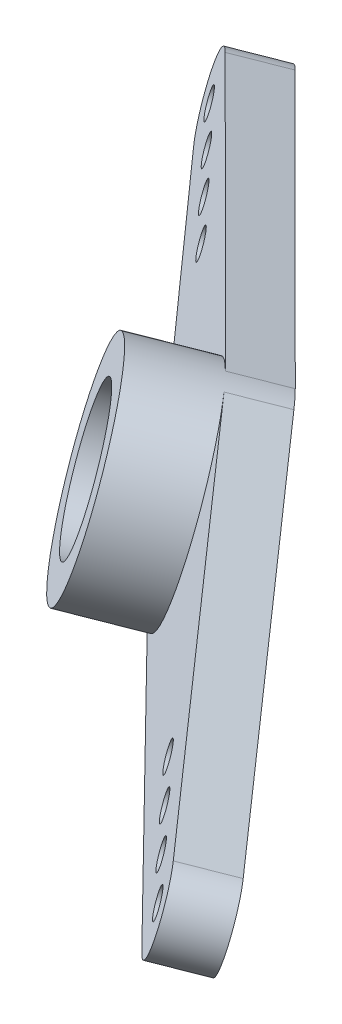
ISO-10303-21;
HEADER;
FILE_DESCRIPTION(('STEP AP214'),'2;1');
FILE_NAME('part.step','',(''),(''),'','','');
FILE_SCHEMA(('AUTOMOTIVE_DESIGN { 1 0 10303 214 1 1 1 1 }'));
ENDSEC;
DATA;
#1=APPLICATION_CONTEXT('core data for automotive mechanical design processes');
#2=APPLICATION_PROTOCOL_DEFINITION('international standard','automotive_design',2000,#1);
#3=PRODUCT_CONTEXT('',#1,'mechanical');
#4=PRODUCT('Part','Part','',(#3));
#5=PRODUCT_RELATED_PRODUCT_CATEGORY('part','',(#4));
#6=PRODUCT_DEFINITION_FORMATION('','',#4);
#7=PRODUCT_DEFINITION_CONTEXT('part definition',#1,'design');
#8=PRODUCT_DEFINITION('design','',#6,#7);
#9=PRODUCT_DEFINITION_SHAPE('','',#8);
#10=(LENGTH_UNIT() NAMED_UNIT(*) SI_UNIT(.MILLI.,.METRE.));
#11=(NAMED_UNIT(*) PLANE_ANGLE_UNIT() SI_UNIT($,.RADIAN.));
#12=(NAMED_UNIT(*) SI_UNIT($,.STERADIAN.) SOLID_ANGLE_UNIT());
#13=UNCERTAINTY_MEASURE_WITH_UNIT(LENGTH_MEASURE(1.E-05),#10,'distance_accuracy_value','');
#14=(GEOMETRIC_REPRESENTATION_CONTEXT(3) GLOBAL_UNCERTAINTY_ASSIGNED_CONTEXT((#13)) GLOBAL_UNIT_ASSIGNED_CONTEXT((#10,
#11,#12)) REPRESENTATION_CONTEXT('',''));
#15=CARTESIAN_POINT('',(0.,0.,0.));
#16=DIRECTION('',(0.,0.,1.));
#17=DIRECTION('',(1.,0.,0.));
#18=AXIS2_PLACEMENT_3D('',#15,#16,#17);
#19=CARTESIAN_POINT('',(-53.5665780673376,-93.2878245452242,38.8750016026437));
#20=DIRECTION('',(0.709922761595776,-0.268514569517587,-0.651083403662704));
#21=DIRECTION('',(-0.675905616300296,0.,-0.736988193836045));
#22=AXIS2_PLACEMENT_3D('',#19,#20,#21);
#23=CYLINDRICAL_SURFACE('',#22,1.13402350588104);
#24=CARTESIAN_POINT('',(-52.5026878168102,-93.6902204791033,37.8992880139147));
#25=DIRECTION('',(-0.709922761595776,0.268514569517587,0.651083403662704));
#26=DIRECTION('',(0.675905616300296,0.,0.736988193836045));
#27=AXIS2_PLACEMENT_3D('',#24,#25,#26);
#28=CIRCLE('',#27,1.13402350588104);
#29=CARTESIAN_POINT('',(-51.7361949601686,-93.6902204791033,38.7350499492816));
#30=VERTEX_POINT('',#29);
#31=EDGE_CURVE('E140',#30,#30,#28,.T.);
#32=ORIENTED_EDGE('',*,*,#31,.F.);
#33=EDGE_LOOP('',(#32));
#34=FACE_BOUND('',#33,.T.);
#35=CARTESIAN_POINT('',(-53.2960974951696,-93.3901285962104,38.6269388258482));
#36=DIRECTION('',(-0.709922761595776,0.268514569517587,0.651083403662705));
#37=DIRECTION('',(0.675905616300297,0.,0.736988193836045));
#38=AXIS2_PLACEMENT_3D('',#35,#36,#37);
#39=CIRCLE('',#38,1.13402350588104);
#40=CARTESIAN_POINT('',(-52.5296046385281,-93.3901285962104,39.4627007612151));
#41=VERTEX_POINT('',#40);
#42=EDGE_CURVE('E41',#41,#41,#39,.T.);
#43=ORIENTED_EDGE('',*,*,#42,.T.);
#44=EDGE_LOOP('',(#43));
#45=FACE_BOUND('',#44,.T.);
#46=ADVANCED_FACE('F37',(#34,#45),#23,.F.);
#47=CARTESIAN_POINT('',(-53.5665780673376,-93.2878245452242,38.8750016026437));
#48=DIRECTION('',(-0.709922761595776,0.268514569517587,0.651083403662704));
#49=DIRECTION('',(0.675905616300296,0.,0.736988193836045));
#50=AXIS2_PLACEMENT_3D('',#47,#48,#49);
#51=PLANE('',#50);
#52=CARTESIAN_POINT('',(-63.7380817432414,-93.9023006433935,28.0377015662634));
#53=DIRECTION('',(-0.709922761595776,0.268514569517587,0.651083403662704));
#54=DIRECTION('',(-0.675905616300296,0.,-0.736988193836045));
#55=AXIS2_PLACEMENT_3D('',#52,#53,#54);
#56=CIRCLE('',#55,0.399750462625913);
#57=CARTESIAN_POINT('',(-64.0082753260489,-93.9023006433935,27.7430901948276));
#58=VERTEX_POINT('',#57);
#59=EDGE_CURVE('E191',#58,#58,#56,.T.);
#60=ORIENTED_EDGE('',*,*,#59,.F.);
#61=EDGE_LOOP('',(#60));
#62=FACE_BOUND('',#61,.T.);
#63=CARTESIAN_POINT('',(-61.3063283656559,-93.7553947015799,30.6286302831066));
#64=DIRECTION('',(-0.709922761595776,0.268514569517587,0.651083403662704));
#65=DIRECTION('',(-0.675905616300296,0.,-0.736988193836045));
#66=AXIS2_PLACEMENT_3D('',#63,#64,#65);
#67=CIRCLE('',#66,0.399750462625915);
#68=CARTESIAN_POINT('',(-61.5765219484634,-93.7553947015799,30.3340189116708));
#69=VERTEX_POINT('',#68);
#70=EDGE_CURVE('E203',#69,#69,#67,.T.);
#71=ORIENTED_EDGE('',*,*,#70,.F.);
#72=EDGE_LOOP('',(#71));
#73=FACE_BOUND('',#72,.T.);
#74=CARTESIAN_POINT('',(-60.0904516768631,-93.6819417306731,31.9240946415282));
#75=DIRECTION('',(-0.709922761595776,0.268514569517587,0.651083403662704));
#76=DIRECTION('',(-0.675905616300296,0.,-0.736988193836045));
#77=AXIS2_PLACEMENT_3D('',#74,#75,#76);
#78=CIRCLE('',#77,0.39975046262591);
#79=CARTESIAN_POINT('',(-60.3606452596706,-93.6819417306731,31.6294832700924));
#80=VERTEX_POINT('',#79);
#81=EDGE_CURVE('E209',#80,#80,#78,.T.);
#82=ORIENTED_EDGE('',*,*,#81,.F.);
#83=EDGE_LOOP('',(#82));
#84=FACE_BOUND('',#83,.T.);
#85=CARTESIAN_POINT('',(-62.5222050544486,-93.8288476724867,29.333165924685));
#86=DIRECTION('',(-0.709922761595776,0.268514569517587,0.651083403662704));
#87=DIRECTION('',(-0.675905616300296,0.,-0.736988193836045));
#88=AXIS2_PLACEMENT_3D('',#85,#86,#87);
#89=CIRCLE('',#88,0.399750462625906);
#90=CARTESIAN_POINT('',(-62.7923986372561,-93.8288476724867,29.0385545532492));
#91=VERTEX_POINT('',#90);
#92=EDGE_CURVE('E197',#91,#91,#89,.T.);
#93=ORIENTED_EDGE('',*,*,#92,.F.);
#94=EDGE_LOOP('',(#93));
#95=FACE_BOUND('',#94,.T.);
#96=DIRECTION('',(0.659303735452533,-0.0716887488780678,0.748451272764389));
#97=VECTOR('',#96,1.);
#98=CARTESIAN_POINT('',(-64.0394447887795,-95.0712729380114,28.1912020339051));
#99=LINE('',#98,#97);
#100=CARTESIAN_POINT('',(-64.0394447887795,-95.0712729380114,28.1912020339051));
#101=VERTEX_POINT('',#100);
#102=CARTESIAN_POINT('',(-54.2993856472221,-96.130348772577,39.2482600623954));
#103=VERTEX_POINT('',#102);
#104=EDGE_CURVE('E121',#101,#103,#99,.T.);
#105=ORIENTED_EDGE('',*,*,#104,.T.);
#106=CARTESIAN_POINT('',(-53.5665780673376,-93.2878245452242,38.8750016026437));
#107=DIRECTION('',(-0.709922761595776,0.268514569517587,0.651083403662705));
#108=DIRECTION('',(0.675905616300297,0.,0.736988193836045));
#109=AXIS2_PLACEMENT_3D('',#106,#107,#108);
#110=CIRCLE('',#109,2.9591);
#111=CARTESIAN_POINT('',(-53.3077059111959,-90.4739314818807,37.9967853167313));
#112=VERTEX_POINT('',#111);
#113=EDGE_CURVE('E100',#112,#103,#110,.T.);
#114=ORIENTED_EDGE('',*,*,#113,.F.);
#115=DIRECTION('',(-0.698824960690639,-0.153735381176378,-0.698576486070266));
#116=VECTOR('',#115,1.);
#117=CARTESIAN_POINT('',(-53.3077059111959,-90.4739314818807,37.9967853167313));
#118=LINE('',#117,#116);
#119=CARTESIAN_POINT('',(-63.6316220073961,-92.7451027558915,27.6765399983038));
#120=VERTEX_POINT('',#119);
#121=EDGE_CURVE('E151',#112,#120,#118,.T.);
#122=ORIENTED_EDGE('',*,*,#121,.T.);
#123=CARTESIAN_POINT('',(-63.7380817432414,-93.9023006433935,28.0377015662634));
#124=DIRECTION('',(-0.709922761595776,0.268514569517587,0.651083403662704));
#125=DIRECTION('',(0.675905616300296,0.,0.736988193836045));
#126=AXIS2_PLACEMENT_3D('',#123,#124,#125);
#127=CIRCLE('',#126,1.21691343339055);
#128=EDGE_CURVE('E168',#120,#101,#127,.T.);
#129=ORIENTED_EDGE('',*,*,#128,.T.);
#130=EDGE_LOOP('',(#105,#114,#122,#129));
#131=FACE_BOUND('',#130,.T.);
#132=ADVANCED_FACE('F241',(#62,#73,#84,#95,#131),#51,.T.);
#133=CARTESIAN_POINT('',(-47.0933141988821,-93.166185704805,45.8830984693304));
#134=DIRECTION('',(-0.709922761595776,0.268514569517587,0.651083403662704));
#135=DIRECTION('',(0.675905616300296,0.,0.736988193836045));
#136=AXIS2_PLACEMENT_3D('',#133,#134,#135);
#137=CIRCLE('',#136,0.399750462625914);
#138=CARTESIAN_POINT('',(-46.8231206160746,-93.166185704805,46.1777098407662));
#139=VERTEX_POINT('',#138);
#140=EDGE_CURVE('E215',#139,#139,#137,.T.);
#141=ORIENTED_EDGE('',*,*,#140,.F.);
#142=EDGE_LOOP('',(#141));
#143=FACE_BOUND('',#142,.T.);
#144=CARTESIAN_POINT('',(-44.6804254431688,-93.1208452094583,48.4953445436762));
#145=DIRECTION('',(-0.709922761595776,0.268514569517587,0.651083403662704));
#146=DIRECTION('',(0.675905616300296,0.,0.736988193836045));
#147=AXIS2_PLACEMENT_3D('',#144,#145,#146);
#148=CIRCLE('',#147,0.3997504626259);
#149=CARTESIAN_POINT('',(-44.4102318603613,-93.1208452094583,48.789955915112));
#150=VERTEX_POINT('',#149);
#151=EDGE_CURVE('E227',#150,#150,#148,.T.);
#152=ORIENTED_EDGE('',*,*,#151,.F.);
#153=EDGE_LOOP('',(#152));
#154=FACE_BOUND('',#153,.T.);
#155=CARTESIAN_POINT('',(-43.4739810653122,-93.098174961785,49.8014675808492));
#156=DIRECTION('',(-0.709922761595776,0.268514569517587,0.651083403662704));
#157=DIRECTION('',(0.675905616300296,0.,0.736988193836045));
#158=AXIS2_PLACEMENT_3D('',#155,#156,#157);
#159=CIRCLE('',#158,0.399750462625922);
#160=CARTESIAN_POINT('',(-43.2037874825046,-93.098174961785,50.096078952285));
#161=VERTEX_POINT('',#160);
#162=EDGE_CURVE('E233',#161,#161,#159,.T.);
#163=ORIENTED_EDGE('',*,*,#162,.F.);
#164=EDGE_LOOP('',(#163));
#165=FACE_BOUND('',#164,.T.);
#166=CARTESIAN_POINT('',(-45.8868698210254,-93.1435154571317,47.1892215065033));
#167=DIRECTION('',(-0.709922761595776,0.268514569517587,0.651083403662704));
#168=DIRECTION('',(0.675905616300296,0.,0.736988193836045));
#169=AXIS2_PLACEMENT_3D('',#166,#167,#168);
#170=CIRCLE('',#169,0.399750462625917);
#171=CARTESIAN_POINT('',(-45.6166762382179,-93.1435154571317,47.4838328779391));
#172=VERTEX_POINT('',#171);
#173=EDGE_CURVE('E221',#172,#172,#170,.T.);
#174=ORIENTED_EDGE('',*,*,#173,.F.);
#175=EDGE_LOOP('',(#174));
#176=FACE_BOUND('',#175,.T.);
#177=DIRECTION('',(-0.651669638706727,0.100144678706578,-0.751862836769181));
#178=VECTOR('',#177,1.);
#179=CARTESIAN_POINT('',(-52.7762360010373,-90.4528415450237,38.5675871969787));
#180=LINE('',#179,#178);
#181=CARTESIAN_POINT('',(-43.1489572819137,-91.9323039549323,49.6750451146022));
#182=VERTEX_POINT('',#181);
#183=CARTESIAN_POINT('',(-52.7762360010373,-90.4528415450237,38.5675871969787));
#184=VERTEX_POINT('',#183);
#185=EDGE_CURVE('E55',#182,#184,#180,.T.);
#186=ORIENTED_EDGE('',*,*,#185,.T.);
#187=CARTESIAN_POINT('',(-53.8866613214476,-96.1139709310406,39.6915284707717));
#188=VERTEX_POINT('',#187);
#189=EDGE_CURVE('E117',#188,#184,#110,.T.);
#190=ORIENTED_EDGE('',*,*,#189,.F.);
#191=DIRECTION('',(0.695923209293828,0.125467241592786,0.70707061744445));
#192=VECTOR('',#191,1.);
#193=CARTESIAN_POINT('',(-43.6056135250904,-94.260411960071,50.137259718509));
#194=LINE('',#193,#192);
#195=CARTESIAN_POINT('',(-43.6056135250904,-94.260411960071,50.137259718509));
#196=VERTEX_POINT('',#195);
#197=EDGE_CURVE('E111',#188,#196,#194,.T.);
#198=ORIENTED_EDGE('',*,*,#197,.T.);
#199=CARTESIAN_POINT('',(-43.4739810653122,-93.098174961785,49.8014675808492));
#200=DIRECTION('',(-0.709922761595776,0.268514569517587,0.651083403662704));
#201=DIRECTION('',(-0.675905616300296,0.,-0.736988193836045));
#202=AXIS2_PLACEMENT_3D('',#199,#200,#201);
#203=CIRCLE('',#202,1.21691343339055);
#204=EDGE_CURVE('E115',#196,#182,#203,.T.);
#205=ORIENTED_EDGE('',*,*,#204,.T.);
#206=EDGE_LOOP('',(#186,#190,#198,#205));
#207=FACE_BOUND('',#206,.T.);
#208=ADVANCED_FACE('F113',(#143,#154,#165,#176,#207),#51,.T.);
#209=CARTESIAN_POINT('',(-52.5026878168102,-93.6902204791033,37.8992880139147));
#210=DIRECTION('',(-0.709922761595776,0.268514569517587,0.651083403662704));
#211=DIRECTION('',(0.675905616300296,0.,0.736988193836045));
#212=AXIS2_PLACEMENT_3D('',#209,#210,#211);
#213=PLANE('',#212);
#214=CARTESIAN_POINT('',(-61.4583148039212,-94.2312436063658,28.3574523359561));
#215=DIRECTION('',(-0.709922761595776,0.268514569517587,0.651083403662704));
#216=DIRECTION('',(-0.675905616300296,0.,-0.736988193836045));
#217=AXIS2_PLACEMENT_3D('',#214,#215,#216);
#218=CIRCLE('',#217,0.399750462625906);
#219=CARTESIAN_POINT('',(-61.7285083867287,-94.2312436063658,28.0628409645203));
#220=VERTEX_POINT('',#219);
#221=EDGE_CURVE('E194',#220,#220,#218,.T.);
#222=ORIENTED_EDGE('',*,*,#221,.T.);
#223=EDGE_LOOP('',(#222));
#224=FACE_BOUND('',#223,.T.);
#225=CARTESIAN_POINT('',(-59.0265614263357,-94.0843376645522,30.9483810527992));
#226=DIRECTION('',(-0.709922761595776,0.268514569517587,0.651083403662704));
#227=DIRECTION('',(-0.675905616300296,0.,-0.736988193836045));
#228=AXIS2_PLACEMENT_3D('',#225,#226,#227);
#229=CIRCLE('',#228,0.39975046262591);
#230=CARTESIAN_POINT('',(-59.2967550091432,-94.0843376645522,30.6537696813635));
#231=VERTEX_POINT('',#230);
#232=EDGE_CURVE('E206',#231,#231,#229,.T.);
#233=ORIENTED_EDGE('',*,*,#232,.T.);
#234=EDGE_LOOP('',(#233));
#235=FACE_BOUND('',#234,.T.);
#236=CARTESIAN_POINT('',(-44.822979570498,-93.5459113910107,46.2135079177744));
#237=DIRECTION('',(-0.709922761595776,0.268514569517587,0.651083403662704));
#238=DIRECTION('',(0.675905616300296,0.,0.736988193836045));
#239=AXIS2_PLACEMENT_3D('',#236,#237,#238);
#240=CIRCLE('',#239,0.399750462625917);
#241=CARTESIAN_POINT('',(-44.5527859876905,-93.5459113910107,46.5081192892102));
#242=VERTEX_POINT('',#241);
#243=EDGE_CURVE('E218',#242,#242,#240,.T.);
#244=ORIENTED_EDGE('',*,*,#243,.T.);
#245=EDGE_LOOP('',(#244));
#246=FACE_BOUND('',#245,.T.);
#247=CARTESIAN_POINT('',(-42.4100908147847,-93.5005708956641,48.8257539921202));
#248=DIRECTION('',(-0.709922761595776,0.268514569517587,0.651083403662704));
#249=DIRECTION('',(0.675905616300296,0.,0.736988193836045));
#250=AXIS2_PLACEMENT_3D('',#247,#248,#249);
#251=CIRCLE('',#250,0.399750462625922);
#252=CARTESIAN_POINT('',(-42.1398972319772,-93.5005708956641,49.120365363556));
#253=VERTEX_POINT('',#252);
#254=EDGE_CURVE('E230',#253,#253,#251,.T.);
#255=ORIENTED_EDGE('',*,*,#254,.T.);
#256=EDGE_LOOP('',(#255));
#257=FACE_BOUND('',#256,.T.);
#258=CARTESIAN_POINT('',(-52.5026878168102,-93.6902204791033,37.8992880139147));
#259=DIRECTION('',(-0.709922761595776,0.268514569517587,0.651083403662704));
#260=DIRECTION('',(0.675905616300296,0.,0.736988193836045));
#261=AXIS2_PLACEMENT_3D('',#258,#259,#260);
#262=CIRCLE('',#261,2.95909999999998);
#263=CARTESIAN_POINT('',(-51.7123457505099,-90.8552374789028,37.5918736082498));
#264=VERTEX_POINT('',#263);
#265=CARTESIAN_POINT('',(-52.2438156606684,-90.8763274157597,37.0210717280024));
#266=VERTEX_POINT('',#265);
#267=EDGE_CURVE('E136',#264,#266,#262,.T.);
#268=ORIENTED_EDGE('',*,*,#267,.F.);
#269=DIRECTION('',(-0.651669638706727,0.100144678706578,-0.751862836769181));
#270=VECTOR('',#269,1.);
#271=CARTESIAN_POINT('',(-51.7123457505099,-90.8552374789028,37.5918736082498));
#272=LINE('',#271,#270);
#273=CARTESIAN_POINT('',(-42.0850670313862,-92.3346998888114,48.6993315258733));
#274=VERTEX_POINT('',#273);
#275=EDGE_CURVE('E91',#274,#264,#272,.T.);
#276=ORIENTED_EDGE('',*,*,#275,.F.);
#277=CARTESIAN_POINT('',(-42.4100908147847,-93.5005708956641,48.8257539921202));
#278=DIRECTION('',(-0.709922761595776,0.268514569517587,0.651083403662704));
#279=DIRECTION('',(-0.675905616300296,0.,-0.736988193836045));
#280=AXIS2_PLACEMENT_3D('',#277,#278,#279);
#281=CIRCLE('',#280,1.21691343339055);
#282=CARTESIAN_POINT('',(-42.541723274563,-94.6628078939501,49.1615461297801));
#283=VERTEX_POINT('',#282);
#284=EDGE_CURVE('E85',#283,#274,#281,.T.);
#285=ORIENTED_EDGE('',*,*,#284,.F.);
#286=DIRECTION('',(0.695923209293828,0.125467241592786,0.70707061744445));
#287=VECTOR('',#286,1.);
#288=CARTESIAN_POINT('',(-42.541723274563,-94.6628078939501,49.1615461297801));
#289=LINE('',#288,#287);
#290=CARTESIAN_POINT('',(-52.8227710709202,-96.5163668649197,38.7158148820428));
#291=VERTEX_POINT('',#290);
#292=EDGE_CURVE('E126',#291,#283,#289,.T.);
#293=ORIENTED_EDGE('',*,*,#292,.F.);
#294=CARTESIAN_POINT('',(-52.5026878168102,-93.6902204791033,37.8992880139147));
#295=DIRECTION('',(-0.709922761595776,0.268514569517587,0.651083403662704));
#296=DIRECTION('',(0.675905616300296,0.,0.736988193836045));
#297=AXIS2_PLACEMENT_3D('',#294,#295,#296);
#298=CIRCLE('',#297,2.95909999999999);
#299=CARTESIAN_POINT('',(-53.2354953966946,-96.532744706456,38.2725464736665));
#300=VERTEX_POINT('',#299);
#301=EDGE_CURVE('E146',#300,#291,#298,.T.);
#302=ORIENTED_EDGE('',*,*,#301,.F.);
#303=DIRECTION('',(0.659303735452533,-0.0716887488780678,0.748451272764389));
#304=VECTOR('',#303,1.);
#305=CARTESIAN_POINT('',(-62.9755545382521,-95.4736688718904,27.2154884451761));
#306=LINE('',#305,#304);
#307=CARTESIAN_POINT('',(-62.9755545382521,-95.4736688718904,27.2154884451761));
#308=VERTEX_POINT('',#307);
#309=EDGE_CURVE('E144',#308,#300,#306,.T.);
#310=ORIENTED_EDGE('',*,*,#309,.F.);
#311=CARTESIAN_POINT('',(-62.6741914927139,-94.3046965772725,27.0619879775345));
#312=DIRECTION('',(-0.709922761595776,0.268514569517587,0.651083403662704));
#313=DIRECTION('',(0.675905616300296,0.,0.736988193836045));
#314=AXIS2_PLACEMENT_3D('',#311,#312,#313);
#315=CIRCLE('',#314,1.21691343339055);
#316=CARTESIAN_POINT('',(-62.5677317568687,-93.1474986897705,26.7008264095749));
#317=VERTEX_POINT('',#316);
#318=EDGE_CURVE('E142',#317,#308,#315,.T.);
#319=ORIENTED_EDGE('',*,*,#318,.F.);
#320=DIRECTION('',(-0.698824960690639,-0.153735381176378,-0.698576486070266));
#321=VECTOR('',#320,1.);
#322=CARTESIAN_POINT('',(-52.2438156606684,-90.8763274157597,37.0210717280024));
#323=LINE('',#322,#321);
#324=EDGE_CURVE('E139',#266,#317,#323,.T.);
#325=ORIENTED_EDGE('',*,*,#324,.F.);
#326=EDGE_LOOP('',(#268,#276,#285,#293,#302,#310,#319,#325));
#327=FACE_BOUND('',#326,.T.);
#328=ORIENTED_EDGE('',*,*,#31,.T.);
#329=EDGE_LOOP('',(#328));
#330=FACE_BOUND('',#329,.T.);
#331=CARTESIAN_POINT('',(-43.6165351926414,-93.5232411433374,47.5196309549473));
#332=DIRECTION('',(-0.709922761595776,0.268514569517587,0.651083403662704));
#333=DIRECTION('',(0.675905616300296,0.,0.736988193836045));
#334=AXIS2_PLACEMENT_3D('',#331,#332,#333);
#335=CIRCLE('',#334,0.3997504626259);
#336=CARTESIAN_POINT('',(-43.3463416098339,-93.5232411433374,47.8142423263831));
#337=VERTEX_POINT('',#336);
#338=EDGE_CURVE('E224',#337,#337,#335,.T.);
#339=ORIENTED_EDGE('',*,*,#338,.T.);
#340=EDGE_LOOP('',(#339));
#341=FACE_BOUND('',#340,.T.);
#342=CARTESIAN_POINT('',(-46.0294239483547,-93.5685816386841,44.9073848806014));
#343=DIRECTION('',(-0.709922761595776,0.268514569517587,0.651083403662704));
#344=DIRECTION('',(0.675905616300296,0.,0.736988193836045));
#345=AXIS2_PLACEMENT_3D('',#342,#343,#344);
#346=CIRCLE('',#345,0.399750462625914);
#347=CARTESIAN_POINT('',(-45.7592303655472,-93.5685816386841,45.2019962520372));
#348=VERTEX_POINT('',#347);
#349=EDGE_CURVE('E212',#348,#348,#346,.T.);
#350=ORIENTED_EDGE('',*,*,#349,.T.);
#351=EDGE_LOOP('',(#350));
#352=FACE_BOUND('',#351,.T.);
#353=CARTESIAN_POINT('',(-60.2424381151284,-94.157790635459,29.6529166943776));
#354=DIRECTION('',(-0.709922761595776,0.268514569517587,0.651083403662704));
#355=DIRECTION('',(-0.675905616300296,0.,-0.736988193836045));
#356=AXIS2_PLACEMENT_3D('',#353,#354,#355);
#357=CIRCLE('',#356,0.399750462625915);
#358=CARTESIAN_POINT('',(-60.5126316979359,-94.157790635459,29.3583053229419));
#359=VERTEX_POINT('',#358);
#360=EDGE_CURVE('E200',#359,#359,#357,.T.);
#361=ORIENTED_EDGE('',*,*,#360,.T.);
#362=EDGE_LOOP('',(#361));
#363=FACE_BOUND('',#362,.T.);
#364=CARTESIAN_POINT('',(-62.6741914927139,-94.3046965772725,27.0619879775345));
#365=DIRECTION('',(-0.709922761595776,0.268514569517587,0.651083403662704));
#366=DIRECTION('',(-0.675905616300296,0.,-0.736988193836045));
#367=AXIS2_PLACEMENT_3D('',#364,#365,#366);
#368=CIRCLE('',#367,0.399750462625913);
#369=CARTESIAN_POINT('',(-62.9443850755214,-94.3046965772725,26.7673766060987));
#370=VERTEX_POINT('',#369);
#371=EDGE_CURVE('E187',#370,#370,#368,.T.);
#372=ORIENTED_EDGE('',*,*,#371,.T.);
#373=EDGE_LOOP('',(#372));
#374=FACE_BOUND('',#373,.T.);
#375=ADVANCED_FACE('F173',(#224,#235,#246,#257,#327,#330,#341,#352,#363,#374),#213,.F.);
#376=CARTESIAN_POINT('',(-53.3077059111959,-90.4739314818807,37.9967853167313));
#377=DIRECTION('',(-0.0874834091925668,-0.950928682147793,0.296784929847705));
#378=DIRECTION('',(0.,-0.297927189637262,-0.954588597079833));
#379=AXIS2_PLACEMENT_3D('',#376,#377,#378);
#380=PLANE('',#379);
#381=ORIENTED_EDGE('',*,*,#324,.T.);
#382=DIRECTION('',(0.709922761595776,-0.268514569517587,-0.651083403662704));
#383=VECTOR('',#382,1.);
#384=CARTESIAN_POINT('',(-63.6316220073961,-92.7451027558915,27.6765399983038));
#385=LINE('',#384,#383);
#386=EDGE_CURVE('E47',#120,#317,#385,.T.);
#387=ORIENTED_EDGE('',*,*,#386,.F.);
#388=ORIENTED_EDGE('',*,*,#121,.F.);
#389=DIRECTION('',(0.709922761595776,-0.268514569517587,-0.651083403662704));
#390=VECTOR('',#389,1.);
#391=CARTESIAN_POINT('',(-53.3077059111959,-90.4739314818807,37.9967853167313));
#392=LINE('',#391,#390);
#393=EDGE_CURVE('E11',#112,#266,#392,.T.);
#394=ORIENTED_EDGE('',*,*,#393,.T.);
#395=EDGE_LOOP('',(#381,#387,#388,#394));
#396=FACE_BOUND('',#395,.T.);
#397=ADVANCED_FACE('F39',(#396),#380,.F.);
#398=CARTESIAN_POINT('',(-63.7380817432414,-93.9023006433935,28.0377015662634));
#399=DIRECTION('',(0.709922761595776,-0.268514569517587,-0.651083403662704));
#400=DIRECTION('',(-0.675905616300296,0.,-0.736988193836045));
#401=AXIS2_PLACEMENT_3D('',#398,#399,#400);
#402=CYLINDRICAL_SURFACE('',#401,1.21691343339055);
#403=ORIENTED_EDGE('',*,*,#318,.T.);
#404=DIRECTION('',(0.709922761595776,-0.268514569517587,-0.651083403662704));
#405=VECTOR('',#404,1.);
#406=CARTESIAN_POINT('',(-64.0394447887795,-95.0712729380114,28.1912020339051));
#407=LINE('',#406,#405);
#408=EDGE_CURVE('E158',#101,#308,#407,.T.);
#409=ORIENTED_EDGE('',*,*,#408,.F.);
#410=ORIENTED_EDGE('',*,*,#128,.F.);
#411=ORIENTED_EDGE('',*,*,#386,.T.);
#412=EDGE_LOOP('',(#403,#409,#410,#411));
#413=FACE_BOUND('',#412,.T.);
#414=ADVANCED_FACE('F166',(#413),#402,.T.);
#415=CARTESIAN_POINT('',(-64.0394447887795,-95.0712729380114,28.1912020339051));
#416=DIRECTION('',(0.247645425935073,0.960604314606739,-0.12613918412751));
#417=DIRECTION('',(-0.968338869557288,0.249639407354916,0.));
#418=AXIS2_PLACEMENT_3D('',#415,#416,#417);
#419=PLANE('',#418);
#420=ORIENTED_EDGE('',*,*,#309,.T.);
#421=DIRECTION('',(0.709922761595776,-0.268514569517587,-0.651083403662704));
#422=VECTOR('',#421,1.);
#423=CARTESIAN_POINT('',(-54.2993856472221,-96.130348772577,39.2482600623954));
#424=LINE('',#423,#422);
#425=EDGE_CURVE('E155',#103,#300,#424,.T.);
#426=ORIENTED_EDGE('',*,*,#425,.F.);
#427=ORIENTED_EDGE('',*,*,#104,.F.);
#428=ORIENTED_EDGE('',*,*,#408,.T.);
#429=EDGE_LOOP('',(#420,#426,#427,#428));
#430=FACE_BOUND('',#429,.T.);
#431=ADVANCED_FACE('F178',(#430),#419,.F.);
#432=CARTESIAN_POINT('',(-53.5665780673376,-93.2878245452242,38.8750016026437));
#433=DIRECTION('',(0.709922761595776,-0.268514569517587,-0.651083403662704));
#434=DIRECTION('',(-0.675905616300296,0.,-0.736988193836045));
#435=AXIS2_PLACEMENT_3D('',#432,#433,#434);
#436=CYLINDRICAL_SURFACE('',#435,2.95909999999999);
#437=ORIENTED_EDGE('',*,*,#301,.T.);
#438=DIRECTION('',(0.709922761595776,-0.268514569517587,-0.651083403662704));
#439=VECTOR('',#438,1.);
#440=CARTESIAN_POINT('',(-53.8866613214476,-96.1139709310406,39.6915284707717));
#441=LINE('',#440,#439);
#442=EDGE_CURVE('E127',#188,#291,#441,.T.);
#443=ORIENTED_EDGE('',*,*,#442,.F.);
#444=ORIENTED_EDGE('',*,*,#189,.T.);
#445=DIRECTION('',(0.709922761595776,-0.268514569517587,-0.651083403662704));
#446=VECTOR('',#445,1.);
#447=CARTESIAN_POINT('',(-52.7762360010373,-90.4528415450237,38.5675871969787));
#448=LINE('',#447,#446);
#449=EDGE_CURVE('E132',#184,#264,#448,.T.);
#450=ORIENTED_EDGE('',*,*,#449,.T.);
#451=ORIENTED_EDGE('',*,*,#267,.T.);
#452=ORIENTED_EDGE('',*,*,#393,.F.);
#453=ORIENTED_EDGE('',*,*,#113,.T.);
#454=ORIENTED_EDGE('',*,*,#425,.T.);
#455=EDGE_LOOP('',(#437,#443,#444,#450,#451,#452,#453,#454));
#456=FACE_BOUND('',#455,.T.);
#457=CARTESIAN_POINT('',(-55.0993013096229,-92.7081015896357,40.2806906711515));
#458=DIRECTION('',(-0.709922761595776,0.268514569517587,0.651083403662705));
#459=DIRECTION('',(0.675905616300297,0.,0.736988193836045));
#460=AXIS2_PLACEMENT_3D('',#457,#458,#459);
#461=CIRCLE('',#460,2.9591);
#462=CARTESIAN_POINT('',(-53.0992290004287,-92.7081015896357,42.4615124355317));
#463=VERTEX_POINT('',#462);
#464=EDGE_CURVE('E184',#463,#463,#461,.T.);
#465=ORIENTED_EDGE('',*,*,#464,.F.);
#466=EDGE_LOOP('',(#465));
#467=FACE_BOUND('',#466,.T.);
#468=ADVANCED_FACE('F181',(#456,#467),#436,.T.);
#469=CARTESIAN_POINT('',(-43.6056135250904,-94.260411960071,50.137259718509));
#470=DIRECTION('',(0.108169123757229,0.955069577174293,-0.275937571602185));
#471=DIRECTION('',(0.,0.277566189388327,0.960706516324545));
#472=AXIS2_PLACEMENT_3D('',#469,#470,#471);
#473=PLANE('',#472);
#474=ORIENTED_EDGE('',*,*,#292,.T.);
#475=DIRECTION('',(0.709922761595776,-0.268514569517587,-0.651083403662704));
#476=VECTOR('',#475,1.);
#477=CARTESIAN_POINT('',(-43.6056135250904,-94.260411960071,50.137259718509));
#478=LINE('',#477,#476);
#479=EDGE_CURVE('E123',#196,#283,#478,.T.);
#480=ORIENTED_EDGE('',*,*,#479,.F.);
#481=ORIENTED_EDGE('',*,*,#197,.F.);
#482=ORIENTED_EDGE('',*,*,#442,.T.);
#483=EDGE_LOOP('',(#474,#480,#481,#482));
#484=FACE_BOUND('',#483,.T.);
#485=ADVANCED_FACE('F124',(#484),#473,.F.);
#486=CARTESIAN_POINT('',(-43.4739810653122,-93.098174961785,49.8014675808492));
#487=DIRECTION('',(0.709922761595776,-0.268514569517587,-0.651083403662704));
#488=DIRECTION('',(-0.675905616300296,0.,-0.736988193836045));
#489=AXIS2_PLACEMENT_3D('',#486,#487,#488);
#490=CYLINDRICAL_SURFACE('',#489,1.21691343339055);
#491=ORIENTED_EDGE('',*,*,#284,.T.);
#492=DIRECTION('',(0.709922761595776,-0.268514569517587,-0.651083403662704));
#493=VECTOR('',#492,1.);
#494=CARTESIAN_POINT('',(-43.1489572819137,-91.9323039549323,49.6750451146022));
#495=LINE('',#494,#493);
#496=EDGE_CURVE('E128',#182,#274,#495,.T.);
#497=ORIENTED_EDGE('',*,*,#496,.F.);
#498=ORIENTED_EDGE('',*,*,#204,.F.);
#499=ORIENTED_EDGE('',*,*,#479,.T.);
#500=EDGE_LOOP('',(#491,#497,#498,#499));
#501=FACE_BOUND('',#500,.T.);
#502=ADVANCED_FACE('F130',(#501),#490,.T.);
#503=CARTESIAN_POINT('',(-52.7762360010373,-90.4528415450237,38.5675871969787));
#504=DIRECTION('',(-0.267088664222335,-0.958055827853232,0.103887805638523));
#505=DIRECTION('',(0.963268049517137,-0.268541737499873,0.));
#506=AXIS2_PLACEMENT_3D('',#503,#504,#505);
#507=PLANE('',#506);
#508=ORIENTED_EDGE('',*,*,#275,.T.);
#509=ORIENTED_EDGE('',*,*,#449,.F.);
#510=ORIENTED_EDGE('',*,*,#185,.F.);
#511=ORIENTED_EDGE('',*,*,#496,.T.);
#512=EDGE_LOOP('',(#508,#509,#510,#511));
#513=FACE_BOUND('',#512,.T.);
#514=ADVANCED_FACE('F242',(#513),#507,.F.);
#515=CARTESIAN_POINT('',(-43.4739810653122,-93.098174961785,49.8014675808492));
#516=DIRECTION('',(0.709922761595776,-0.268514569517587,-0.651083403662704));
#517=DIRECTION('',(-0.675905616300296,0.,-0.736988193836045));
#518=AXIS2_PLACEMENT_3D('',#515,#516,#517);
#519=CYLINDRICAL_SURFACE('',#518,0.399750462625922);
#520=ORIENTED_EDGE('',*,*,#162,.T.);
#521=EDGE_LOOP('',(#520));
#522=FACE_BOUND('',#521,.T.);
#523=ORIENTED_EDGE('',*,*,#254,.F.);
#524=EDGE_LOOP('',(#523));
#525=FACE_BOUND('',#524,.T.);
#526=ADVANCED_FACE('F244',(#522,#525),#519,.F.);
#527=CARTESIAN_POINT('',(-44.6804254431688,-93.1208452094583,48.4953445436762));
#528=DIRECTION('',(0.709922761595776,-0.268514569517587,-0.651083403662704));
#529=DIRECTION('',(-0.675905616300296,0.,-0.736988193836045));
#530=AXIS2_PLACEMENT_3D('',#527,#528,#529);
#531=CYLINDRICAL_SURFACE('',#530,0.3997504626259);
#532=ORIENTED_EDGE('',*,*,#151,.T.);
#533=EDGE_LOOP('',(#532));
#534=FACE_BOUND('',#533,.T.);
#535=ORIENTED_EDGE('',*,*,#338,.F.);
#536=EDGE_LOOP('',(#535));
#537=FACE_BOUND('',#536,.T.);
#538=ADVANCED_FACE('F250',(#534,#537),#531,.F.);
#539=CARTESIAN_POINT('',(-45.8868698210254,-93.1435154571317,47.1892215065033));
#540=DIRECTION('',(0.709922761595776,-0.268514569517587,-0.651083403662704));
#541=DIRECTION('',(-0.675905616300296,0.,-0.736988193836045));
#542=AXIS2_PLACEMENT_3D('',#539,#540,#541);
#543=CYLINDRICAL_SURFACE('',#542,0.399750462625917);
#544=ORIENTED_EDGE('',*,*,#173,.T.);
#545=EDGE_LOOP('',(#544));
#546=FACE_BOUND('',#545,.T.);
#547=ORIENTED_EDGE('',*,*,#243,.F.);
#548=EDGE_LOOP('',(#547));
#549=FACE_BOUND('',#548,.T.);
#550=ADVANCED_FACE('F282',(#546,#549),#543,.F.);
#551=CARTESIAN_POINT('',(-47.0933141988821,-93.166185704805,45.8830984693304));
#552=DIRECTION('',(0.709922761595776,-0.268514569517587,-0.651083403662704));
#553=DIRECTION('',(-0.675905616300296,0.,-0.736988193836045));
#554=AXIS2_PLACEMENT_3D('',#551,#552,#553);
#555=CYLINDRICAL_SURFACE('',#554,0.399750462625914);
#556=ORIENTED_EDGE('',*,*,#140,.T.);
#557=EDGE_LOOP('',(#556));
#558=FACE_BOUND('',#557,.T.);
#559=ORIENTED_EDGE('',*,*,#349,.F.);
#560=EDGE_LOOP('',(#559));
#561=FACE_BOUND('',#560,.T.);
#562=ADVANCED_FACE('F284',(#558,#561),#555,.F.);
#563=CARTESIAN_POINT('',(-60.0904516768631,-93.6819417306731,31.9240946415282));
#564=DIRECTION('',(0.709922761595776,-0.268514569517587,-0.651083403662704));
#565=DIRECTION('',(-0.675905616300296,0.,-0.736988193836045));
#566=AXIS2_PLACEMENT_3D('',#563,#564,#565);
#567=CYLINDRICAL_SURFACE('',#566,0.39975046262591);
#568=ORIENTED_EDGE('',*,*,#81,.T.);
#569=EDGE_LOOP('',(#568));
#570=FACE_BOUND('',#569,.T.);
#571=ORIENTED_EDGE('',*,*,#232,.F.);
#572=EDGE_LOOP('',(#571));
#573=FACE_BOUND('',#572,.T.);
#574=ADVANCED_FACE('F291',(#570,#573),#567,.F.);
#575=CARTESIAN_POINT('',(-61.3063283656559,-93.7553947015799,30.6286302831066));
#576=DIRECTION('',(0.709922761595776,-0.268514569517587,-0.651083403662704));
#577=DIRECTION('',(-0.675905616300296,0.,-0.736988193836045));
#578=AXIS2_PLACEMENT_3D('',#575,#576,#577);
#579=CYLINDRICAL_SURFACE('',#578,0.399750462625915);
#580=ORIENTED_EDGE('',*,*,#70,.T.);
#581=EDGE_LOOP('',(#580));
#582=FACE_BOUND('',#581,.T.);
#583=ORIENTED_EDGE('',*,*,#360,.F.);
#584=EDGE_LOOP('',(#583));
#585=FACE_BOUND('',#584,.T.);
#586=ADVANCED_FACE('F298',(#582,#585),#579,.F.);
#587=CARTESIAN_POINT('',(-62.5222050544486,-93.8288476724867,29.333165924685));
#588=DIRECTION('',(0.709922761595776,-0.268514569517587,-0.651083403662704));
#589=DIRECTION('',(-0.675905616300296,0.,-0.736988193836045));
#590=AXIS2_PLACEMENT_3D('',#587,#588,#589);
#591=CYLINDRICAL_SURFACE('',#590,0.399750462625906);
#592=ORIENTED_EDGE('',*,*,#92,.T.);
#593=EDGE_LOOP('',(#592));
#594=FACE_BOUND('',#593,.T.);
#595=ORIENTED_EDGE('',*,*,#221,.F.);
#596=EDGE_LOOP('',(#595));
#597=FACE_BOUND('',#596,.T.);
#598=ADVANCED_FACE('F302',(#594,#597),#591,.F.);
#599=CARTESIAN_POINT('',(-63.7380817432414,-93.9023006433935,28.0377015662634));
#600=DIRECTION('',(0.709922761595776,-0.268514569517587,-0.651083403662704));
#601=DIRECTION('',(-0.675905616300296,0.,-0.736988193836045));
#602=AXIS2_PLACEMENT_3D('',#599,#600,#601);
#603=CYLINDRICAL_SURFACE('',#602,0.399750462625913);
#604=ORIENTED_EDGE('',*,*,#59,.T.);
#605=EDGE_LOOP('',(#604));
#606=FACE_BOUND('',#605,.T.);
#607=ORIENTED_EDGE('',*,*,#371,.F.);
#608=EDGE_LOOP('',(#607));
#609=FACE_BOUND('',#608,.T.);
#610=ADVANCED_FACE('F306',(#606,#609),#603,.F.);
#611=CARTESIAN_POINT('',(-55.0993013096229,-92.7081015896357,40.2806906711515));
#612=DIRECTION('',(-0.709922761595776,0.268514569517587,0.651083403662705));
#613=DIRECTION('',(0.675905616300297,0.,0.736988193836045));
#614=AXIS2_PLACEMENT_3D('',#611,#612,#613);
#615=PLANE('',#614);
#616=CARTESIAN_POINT('',(-55.0993013096229,-92.7081015896357,40.2806906711515));
#617=DIRECTION('',(-0.709922761595776,0.268514569517587,0.651083403662705));
#618=DIRECTION('',(0.675905616300297,0.,0.736988193836045));
#619=AXIS2_PLACEMENT_3D('',#616,#617,#618);
#620=CIRCLE('',#619,1.9812);
#621=CARTESIAN_POINT('',(-53.7601971026087,-92.7081015896357,41.7408116807795));
#622=VERTEX_POINT('',#621);
#623=EDGE_CURVE('E330',#622,#622,#620,.T.);
#624=ORIENTED_EDGE('',*,*,#623,.F.);
#625=EDGE_LOOP('',(#624));
#626=FACE_BOUND('',#625,.T.);
#627=ORIENTED_EDGE('',*,*,#464,.T.);
#628=EDGE_LOOP('',(#627));
#629=FACE_BOUND('',#628,.T.);
#630=ADVANCED_FACE('F310',(#626,#629),#615,.T.);
#631=CARTESIAN_POINT('',(-53.2960974951696,-93.3901285962104,38.6269388258482));
#632=DIRECTION('',(-0.709922761595776,0.268514569517587,0.651083403662705));
#633=DIRECTION('',(0.675905616300297,0.,0.736988193836045));
#634=AXIS2_PLACEMENT_3D('',#631,#632,#633);
#635=CYLINDRICAL_SURFACE('',#634,1.9812);
#636=CARTESIAN_POINT('',(-53.2960974951696,-93.3901285962104,38.6269388258482));
#637=DIRECTION('',(-0.709922761595776,0.268514569517587,0.651083403662705));
#638=DIRECTION('',(0.675905616300297,0.,0.736988193836045));
#639=AXIS2_PLACEMENT_3D('',#636,#637,#638);
#640=CIRCLE('',#639,1.9812);
#641=CARTESIAN_POINT('',(-51.9569932881555,-93.3901285962104,40.0870598354762));
#642=VERTEX_POINT('',#641);
#643=EDGE_CURVE('E329',#642,#642,#640,.T.);
#644=ORIENTED_EDGE('',*,*,#643,.F.);
#645=EDGE_LOOP('',(#644));
#646=FACE_BOUND('',#645,.T.);
#647=ORIENTED_EDGE('',*,*,#623,.T.);
#648=EDGE_LOOP('',(#647));
#649=FACE_BOUND('',#648,.T.);
#650=ADVANCED_FACE('F314',(#646,#649),#635,.F.);
#651=CARTESIAN_POINT('',(-53.2960974951696,-93.3901285962104,38.6269388258482));
#652=DIRECTION('',(-0.709922761595776,0.268514569517587,0.651083403662705));
#653=DIRECTION('',(0.675905616300297,0.,0.736988193836045));
#654=AXIS2_PLACEMENT_3D('',#651,#652,#653);
#655=PLANE('',#654);
#656=ORIENTED_EDGE('',*,*,#42,.F.);
#657=EDGE_LOOP('',(#656));
#658=FACE_BOUND('',#657,.T.);
#659=ORIENTED_EDGE('',*,*,#643,.T.);
#660=EDGE_LOOP('',(#659));
#661=FACE_BOUND('',#660,.T.);
#662=ADVANCED_FACE('F318',(#658,#661),#655,.T.);
#663=CLOSED_SHELL('',(#46,#132,#208,#375,#397,#414,#431,#468,#485,#502,#514,#526,#538,#550,#562,
#574,#586,#598,#610,#630,#650,#662));
#664=MANIFOLD_SOLID_BREP('B2',#663);
#665=ADVANCED_BREP_SHAPE_REPRESENTATION('',(#18,#664),#14);
#666=SHAPE_DEFINITION_REPRESENTATION(#9,#665);
ENDSEC;
END-ISO-10303-21;
